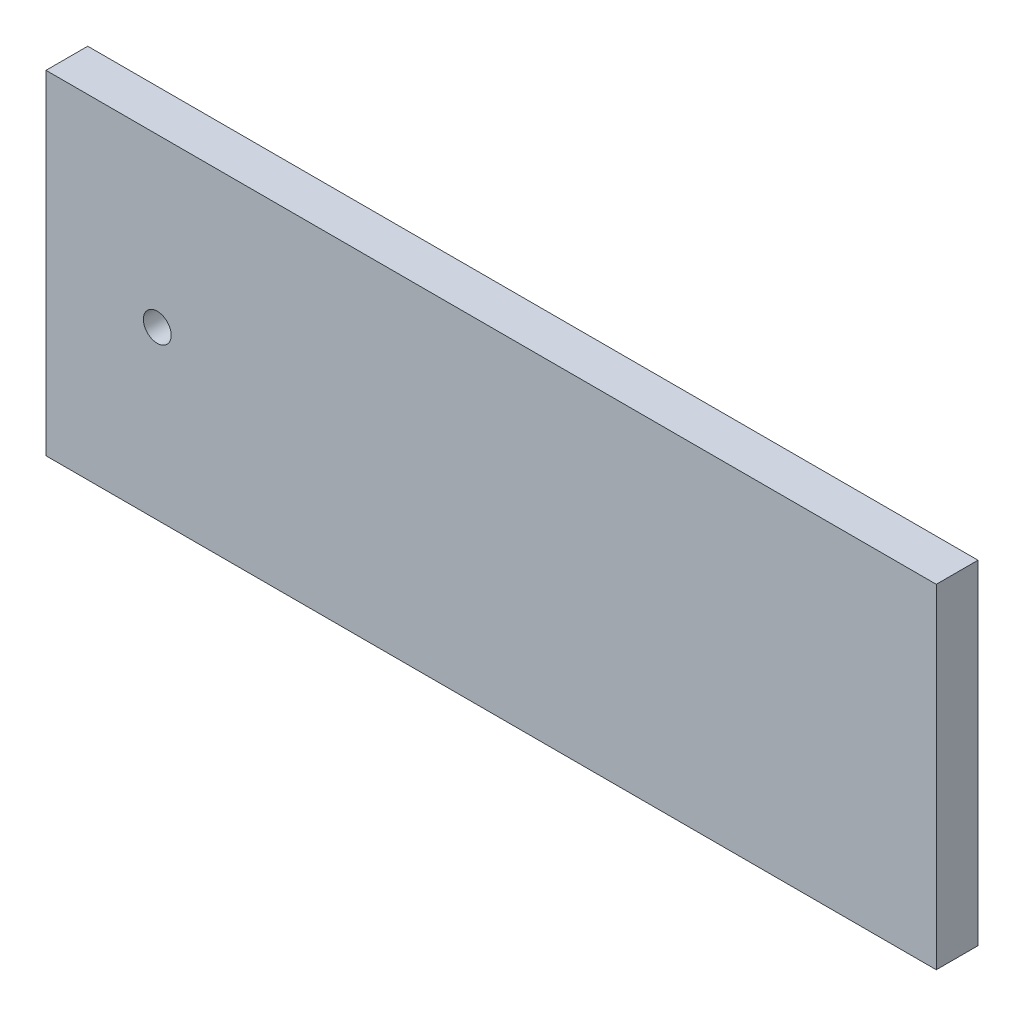
ISO-10303-21;
HEADER;
FILE_DESCRIPTION(('STEP AP214'),'2;1');
FILE_NAME('part.step','',(''),(''),'','','');
FILE_SCHEMA(('AUTOMOTIVE_DESIGN { 1 0 10303 214 1 1 1 1 }'));
ENDSEC;
DATA;
#1=APPLICATION_CONTEXT('core data for automotive mechanical design processes');
#2=APPLICATION_PROTOCOL_DEFINITION('international standard','automotive_design',2000,#1);
#3=PRODUCT_CONTEXT('',#1,'mechanical');
#4=PRODUCT('Part','Part','',(#3));
#5=PRODUCT_RELATED_PRODUCT_CATEGORY('part','',(#4));
#6=PRODUCT_DEFINITION_FORMATION('','',#4);
#7=PRODUCT_DEFINITION_CONTEXT('part definition',#1,'design');
#8=PRODUCT_DEFINITION('design','',#6,#7);
#9=PRODUCT_DEFINITION_SHAPE('','',#8);
#10=(LENGTH_UNIT() NAMED_UNIT(*) SI_UNIT(.MILLI.,.METRE.));
#11=(NAMED_UNIT(*) PLANE_ANGLE_UNIT() SI_UNIT($,.RADIAN.));
#12=(NAMED_UNIT(*) SI_UNIT($,.STERADIAN.) SOLID_ANGLE_UNIT());
#13=UNCERTAINTY_MEASURE_WITH_UNIT(LENGTH_MEASURE(1.E-05),#10,'distance_accuracy_value','');
#14=(GEOMETRIC_REPRESENTATION_CONTEXT(3) GLOBAL_UNCERTAINTY_ASSIGNED_CONTEXT((#13)) GLOBAL_UNIT_ASSIGNED_CONTEXT((#10,
#11,#12)) REPRESENTATION_CONTEXT('',''));
#15=CARTESIAN_POINT('',(0.,0.,0.));
#16=DIRECTION('',(0.,0.,1.));
#17=DIRECTION('',(1.,0.,0.));
#18=AXIS2_PLACEMENT_3D('',#15,#16,#17);
#19=CARTESIAN_POINT('',(0.,0.,9.525));
#20=DIRECTION('',(1.,0.,0.));
#21=DIRECTION('',(0.,0.,-1.));
#22=AXIS2_PLACEMENT_3D('',#19,#20,#21);
#23=PLANE('',#22);
#24=DIRECTION('',(0.,-1.,0.));
#25=VECTOR('',#24,1.);
#26=CARTESIAN_POINT('',(0.,0.,0.));
#27=LINE('',#26,#25);
#28=CARTESIAN_POINT('',(0.,76.2,0.));
#29=VERTEX_POINT('',#28);
#30=CARTESIAN_POINT('',(0.,0.,0.));
#31=VERTEX_POINT('',#30);
#32=EDGE_CURVE('E105',#29,#31,#27,.T.);
#33=ORIENTED_EDGE('',*,*,#32,.T.);
#34=DIRECTION('',(0.,0.,-1.));
#35=VECTOR('',#34,1.);
#36=CARTESIAN_POINT('',(0.,0.,9.525));
#37=LINE('',#36,#35);
#38=CARTESIAN_POINT('',(0.,0.,9.525));
#39=VERTEX_POINT('',#38);
#40=EDGE_CURVE('E11',#39,#31,#37,.T.);
#41=ORIENTED_EDGE('',*,*,#40,.F.);
#42=DIRECTION('',(0.,-1.,0.));
#43=VECTOR('',#42,1.);
#44=CARTESIAN_POINT('',(0.,0.,9.525));
#45=LINE('',#44,#43);
#46=CARTESIAN_POINT('',(0.,76.2,9.525));
#47=VERTEX_POINT('',#46);
#48=EDGE_CURVE('E89',#47,#39,#45,.T.);
#49=ORIENTED_EDGE('',*,*,#48,.F.);
#50=DIRECTION('',(0.,0.,-1.));
#51=VECTOR('',#50,1.);
#52=CARTESIAN_POINT('',(0.,76.2,9.525));
#53=LINE('',#52,#51);
#54=EDGE_CURVE('E97',#47,#29,#53,.T.);
#55=ORIENTED_EDGE('',*,*,#54,.T.);
#56=EDGE_LOOP('',(#33,#41,#49,#55));
#57=FACE_BOUND('',#56,.T.);
#58=ADVANCED_FACE('F39',(#57),#23,.F.);
#59=CARTESIAN_POINT('',(0.,0.,9.525));
#60=DIRECTION('',(0.,1.,0.));
#61=DIRECTION('',(0.,0.,1.));
#62=AXIS2_PLACEMENT_3D('',#59,#60,#61);
#63=PLANE('',#62);
#64=DIRECTION('',(1.,0.,0.));
#65=VECTOR('',#64,1.);
#66=CARTESIAN_POINT('',(0.,0.,0.));
#67=LINE('',#66,#65);
#68=CARTESIAN_POINT('',(203.2,0.,0.));
#69=VERTEX_POINT('',#68);
#70=EDGE_CURVE('E92',#31,#69,#67,.T.);
#71=ORIENTED_EDGE('',*,*,#70,.T.);
#72=DIRECTION('',(0.,0.,-1.));
#73=VECTOR('',#72,1.);
#74=CARTESIAN_POINT('',(203.2,0.,9.525));
#75=LINE('',#74,#73);
#76=CARTESIAN_POINT('',(203.2,0.,9.525));
#77=VERTEX_POINT('',#76);
#78=EDGE_CURVE('E50',#77,#69,#75,.T.);
#79=ORIENTED_EDGE('',*,*,#78,.F.);
#80=DIRECTION('',(1.,0.,0.));
#81=VECTOR('',#80,1.);
#82=CARTESIAN_POINT('',(0.,0.,9.525));
#83=LINE('',#82,#81);
#84=EDGE_CURVE('E82',#39,#77,#83,.T.);
#85=ORIENTED_EDGE('',*,*,#84,.F.);
#86=ORIENTED_EDGE('',*,*,#40,.T.);
#87=EDGE_LOOP('',(#71,#79,#85,#86));
#88=FACE_BOUND('',#87,.T.);
#89=ADVANCED_FACE('F93',(#88),#63,.F.);
#90=CARTESIAN_POINT('',(203.2,0.,9.525));
#91=DIRECTION('',(-1.,0.,0.));
#92=DIRECTION('',(0.,0.,1.));
#93=AXIS2_PLACEMENT_3D('',#90,#91,#92);
#94=PLANE('',#93);
#95=DIRECTION('',(0.,1.,0.));
#96=VECTOR('',#95,1.);
#97=CARTESIAN_POINT('',(203.2,0.,0.));
#98=LINE('',#97,#96);
#99=CARTESIAN_POINT('',(203.2,76.2,0.));
#100=VERTEX_POINT('',#99);
#101=EDGE_CURVE('E75',#69,#100,#98,.T.);
#102=ORIENTED_EDGE('',*,*,#101,.T.);
#103=DIRECTION('',(0.,0.,-1.));
#104=VECTOR('',#103,1.);
#105=CARTESIAN_POINT('',(203.2,76.2,9.525));
#106=LINE('',#105,#104);
#107=CARTESIAN_POINT('',(203.2,76.2,9.525));
#108=VERTEX_POINT('',#107);
#109=EDGE_CURVE('E94',#108,#100,#106,.T.);
#110=ORIENTED_EDGE('',*,*,#109,.F.);
#111=DIRECTION('',(0.,1.,0.));
#112=VECTOR('',#111,1.);
#113=CARTESIAN_POINT('',(203.2,0.,9.525));
#114=LINE('',#113,#112);
#115=EDGE_CURVE('E88',#77,#108,#114,.T.);
#116=ORIENTED_EDGE('',*,*,#115,.F.);
#117=ORIENTED_EDGE('',*,*,#78,.T.);
#118=EDGE_LOOP('',(#102,#110,#116,#117));
#119=FACE_BOUND('',#118,.T.);
#120=ADVANCED_FACE('F96',(#119),#94,.F.);
#121=CARTESIAN_POINT('',(0.,76.2,9.525));
#122=DIRECTION('',(0.,-1.,0.));
#123=DIRECTION('',(0.,0.,-1.));
#124=AXIS2_PLACEMENT_3D('',#121,#122,#123);
#125=PLANE('',#124);
#126=DIRECTION('',(-1.,0.,0.));
#127=VECTOR('',#126,1.);
#128=CARTESIAN_POINT('',(0.,76.2,0.));
#129=LINE('',#128,#127);
#130=EDGE_CURVE('E76',#100,#29,#129,.T.);
#131=ORIENTED_EDGE('',*,*,#130,.T.);
#132=ORIENTED_EDGE('',*,*,#54,.F.);
#133=DIRECTION('',(-1.,0.,0.));
#134=VECTOR('',#133,1.);
#135=CARTESIAN_POINT('',(0.,76.2,9.525));
#136=LINE('',#135,#134);
#137=EDGE_CURVE('E54',#108,#47,#136,.T.);
#138=ORIENTED_EDGE('',*,*,#137,.F.);
#139=ORIENTED_EDGE('',*,*,#109,.T.);
#140=EDGE_LOOP('',(#131,#132,#138,#139));
#141=FACE_BOUND('',#140,.T.);
#142=ADVANCED_FACE('F109',(#141),#125,.F.);
#143=CARTESIAN_POINT('',(0.,0.,9.525));
#144=DIRECTION('',(0.,0.,-1.));
#145=DIRECTION('',(-1.,0.,0.));
#146=AXIS2_PLACEMENT_3D('',#143,#144,#145);
#147=PLANE('',#146);
#148=CARTESIAN_POINT('',(25.4,38.1,9.525));
#149=DIRECTION('',(0.,0.,1.));
#150=DIRECTION('',(1.,0.,0.));
#151=AXIS2_PLACEMENT_3D('',#148,#149,#150);
#152=CIRCLE('',#151,3.175);
#153=CARTESIAN_POINT('',(28.575,38.1,9.525));
#154=VERTEX_POINT('',#153);
#155=EDGE_CURVE('E103',#154,#154,#152,.T.);
#156=ORIENTED_EDGE('',*,*,#155,.F.);
#157=EDGE_LOOP('',(#156));
#158=FACE_BOUND('',#157,.T.);
#159=ORIENTED_EDGE('',*,*,#48,.T.);
#160=ORIENTED_EDGE('',*,*,#84,.T.);
#161=ORIENTED_EDGE('',*,*,#115,.T.);
#162=ORIENTED_EDGE('',*,*,#137,.T.);
#163=EDGE_LOOP('',(#159,#160,#161,#162));
#164=FACE_BOUND('',#163,.T.);
#165=ADVANCED_FACE('F86',(#158,#164),#147,.F.);
#166=CARTESIAN_POINT('',(0.,0.,0.));
#167=DIRECTION('',(0.,0.,-1.));
#168=DIRECTION('',(-1.,0.,0.));
#169=AXIS2_PLACEMENT_3D('',#166,#167,#168);
#170=PLANE('',#169);
#171=CARTESIAN_POINT('',(25.4,38.1,0.));
#172=DIRECTION('',(0.,0.,1.));
#173=DIRECTION('',(1.,0.,0.));
#174=AXIS2_PLACEMENT_3D('',#171,#172,#173);
#175=CIRCLE('',#174,3.175);
#176=CARTESIAN_POINT('',(28.575,38.1,0.));
#177=VERTEX_POINT('',#176);
#178=EDGE_CURVE('E118',#177,#177,#175,.T.);
#179=ORIENTED_EDGE('',*,*,#178,.T.);
#180=EDGE_LOOP('',(#179));
#181=FACE_BOUND('',#180,.T.);
#182=ORIENTED_EDGE('',*,*,#32,.F.);
#183=ORIENTED_EDGE('',*,*,#130,.F.);
#184=ORIENTED_EDGE('',*,*,#101,.F.);
#185=ORIENTED_EDGE('',*,*,#70,.F.);
#186=EDGE_LOOP('',(#182,#183,#184,#185));
#187=FACE_BOUND('',#186,.T.);
#188=ADVANCED_FACE('F111',(#181,#187),#170,.T.);
#189=CARTESIAN_POINT('',(25.4,38.1,9.525));
#190=DIRECTION('',(0.,0.,-1.));
#191=DIRECTION('',(-1.,0.,0.));
#192=AXIS2_PLACEMENT_3D('',#189,#190,#191);
#193=CYLINDRICAL_SURFACE('',#192,3.175);
#194=ORIENTED_EDGE('',*,*,#155,.T.);
#195=EDGE_LOOP('',(#194));
#196=FACE_BOUND('',#195,.T.);
#197=ORIENTED_EDGE('',*,*,#178,.F.);
#198=EDGE_LOOP('',(#197));
#199=FACE_BOUND('',#198,.T.);
#200=ADVANCED_FACE('F122',(#196,#199),#193,.F.);
#201=CLOSED_SHELL('',(#58,#89,#120,#142,#165,#188,#200));
#202=MANIFOLD_SOLID_BREP('B2',#201);
#203=ADVANCED_BREP_SHAPE_REPRESENTATION('',(#18,#202),#14);
#204=SHAPE_DEFINITION_REPRESENTATION(#9,#203);
ENDSEC;
END-ISO-10303-21;
